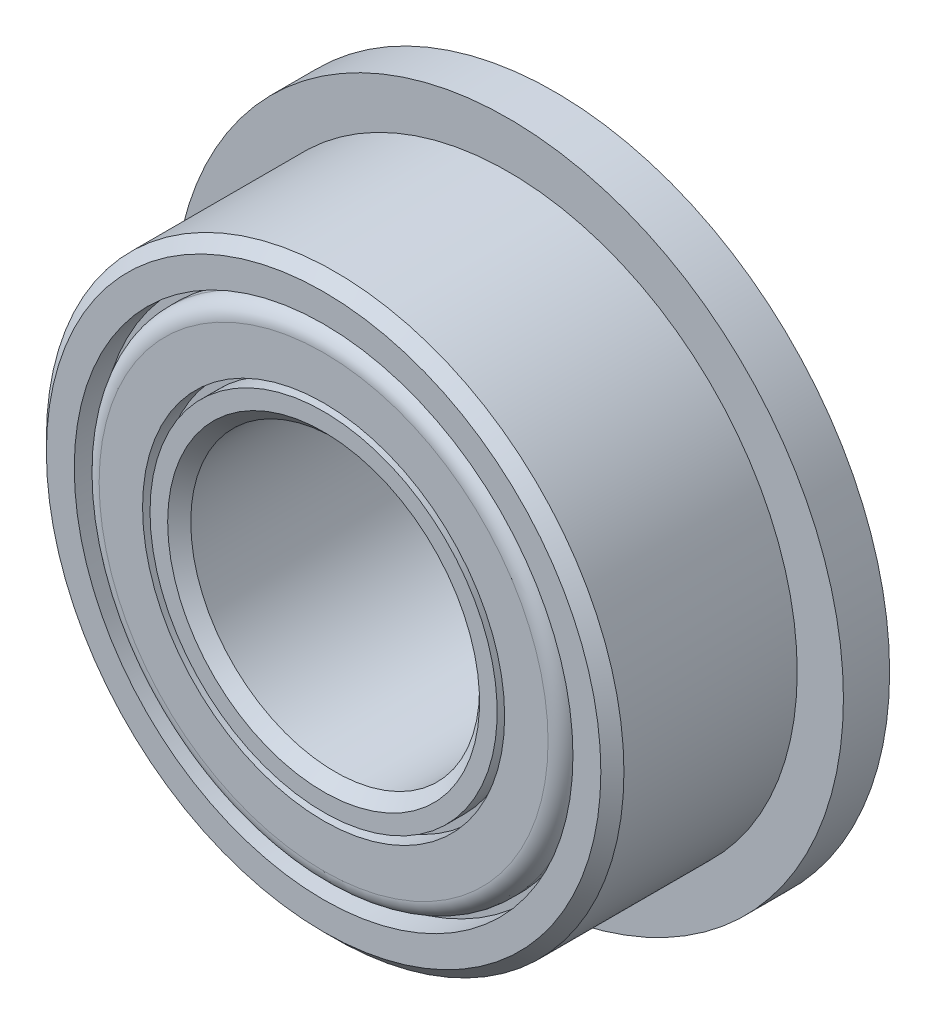
ISO-10303-21;
HEADER;
FILE_DESCRIPTION(('STEP AP214'),'2;1');
FILE_NAME('part.step','',(''),(''),'','','');
FILE_SCHEMA(('AUTOMOTIVE_DESIGN { 1 0 10303 214 1 1 1 1 }'));
ENDSEC;
DATA;
#1=APPLICATION_CONTEXT('core data for automotive mechanical design processes');
#2=APPLICATION_PROTOCOL_DEFINITION('international standard','automotive_design',2000,#1);
#3=PRODUCT_CONTEXT('',#1,'mechanical');
#4=PRODUCT('Part','Part','',(#3));
#5=PRODUCT_RELATED_PRODUCT_CATEGORY('part','',(#4));
#6=PRODUCT_DEFINITION_FORMATION('','',#4);
#7=PRODUCT_DEFINITION_CONTEXT('part definition',#1,'design');
#8=PRODUCT_DEFINITION('design','',#6,#7);
#9=PRODUCT_DEFINITION_SHAPE('','',#8);
#10=(LENGTH_UNIT() NAMED_UNIT(*) SI_UNIT(.MILLI.,.METRE.));
#11=(NAMED_UNIT(*) PLANE_ANGLE_UNIT() SI_UNIT($,.RADIAN.));
#12=(NAMED_UNIT(*) SI_UNIT($,.STERADIAN.) SOLID_ANGLE_UNIT());
#13=UNCERTAINTY_MEASURE_WITH_UNIT(LENGTH_MEASURE(1.E-05),#10,'distance_accuracy_value','');
#14=(GEOMETRIC_REPRESENTATION_CONTEXT(3) GLOBAL_UNCERTAINTY_ASSIGNED_CONTEXT((#13)) GLOBAL_UNIT_ASSIGNED_CONTEXT((#10,
#11,#12)) REPRESENTATION_CONTEXT('',''));
#15=CARTESIAN_POINT('',(0.,0.,0.));
#16=DIRECTION('',(0.,0.,1.));
#17=DIRECTION('',(1.,0.,0.));
#18=AXIS2_PLACEMENT_3D('',#15,#16,#17);
#19=CARTESIAN_POINT('',(0.,2.5,-2.));
#20=DIRECTION('',(0.,0.,1.));
#21=DIRECTION('',(1.,0.,0.));
#22=AXIS2_PLACEMENT_3D('',#19,#20,#21);
#23=PLANE('',#22);
#24=CARTESIAN_POINT('',(0.,0.,-2.));
#25=DIRECTION('',(0.,0.,-1.));
#26=DIRECTION('',(-1.,0.,0.));
#27=AXIS2_PLACEMENT_3D('',#24,#25,#26);
#28=CIRCLE('',#27,3.00552835449253);
#29=CARTESIAN_POINT('',(-3.00552835449253,0.,-2.));
#30=VERTEX_POINT('',#29);
#31=EDGE_CURVE('E103',#30,#30,#28,.T.);
#32=ORIENTED_EDGE('',*,*,#31,.T.);
#33=EDGE_LOOP('',(#32));
#34=FACE_BOUND('',#33,.T.);
#35=CARTESIAN_POINT('',(0.,0.,-2.));
#36=DIRECTION('',(0.,0.,1.));
#37=DIRECTION('',(1.,0.,0.));
#38=AXIS2_PLACEMENT_3D('',#35,#36,#37);
#39=CIRCLE('',#38,2.7);
#40=CARTESIAN_POINT('',(2.7,0.,-2.));
#41=VERTEX_POINT('',#40);
#42=EDGE_CURVE('E70',#41,#41,#39,.T.);
#43=ORIENTED_EDGE('',*,*,#42,.T.);
#44=EDGE_LOOP('',(#43));
#45=FACE_BOUND('',#44,.T.);
#46=ADVANCED_FACE('F35',(#34,#45),#23,.F.);
#47=CARTESIAN_POINT('',(0.,2.5,2.));
#48=DIRECTION('',(0.,0.,-1.));
#49=DIRECTION('',(-1.,0.,0.));
#50=AXIS2_PLACEMENT_3D('',#47,#48,#49);
#51=PLANE('',#50);
#52=CARTESIAN_POINT('',(0.,0.,2.));
#53=DIRECTION('',(0.,0.,-1.));
#54=DIRECTION('',(-1.,0.,0.));
#55=AXIS2_PLACEMENT_3D('',#52,#53,#54);
#56=CIRCLE('',#55,3.00552835449253);
#57=CARTESIAN_POINT('',(-3.00552835449253,0.,2.));
#58=VERTEX_POINT('',#57);
#59=EDGE_CURVE('E82',#58,#58,#56,.T.);
#60=ORIENTED_EDGE('',*,*,#59,.F.);
#61=EDGE_LOOP('',(#60));
#62=FACE_BOUND('',#61,.T.);
#63=CARTESIAN_POINT('',(0.,0.,2.));
#64=DIRECTION('',(0.,0.,-1.));
#65=DIRECTION('',(-1.,0.,0.));
#66=AXIS2_PLACEMENT_3D('',#63,#64,#65);
#67=CIRCLE('',#66,2.7);
#68=CARTESIAN_POINT('',(-2.7,0.,2.));
#69=VERTEX_POINT('',#68);
#70=EDGE_CURVE('E58',#69,#69,#67,.T.);
#71=ORIENTED_EDGE('',*,*,#70,.T.);
#72=EDGE_LOOP('',(#71));
#73=FACE_BOUND('',#72,.T.);
#74=ADVANCED_FACE('F147',(#62,#73),#51,.F.);
#75=CARTESIAN_POINT('',(0.,0.,2.));
#76=DIRECTION('',(0.,0.,-1.));
#77=DIRECTION('',(-1.,0.,0.));
#78=AXIS2_PLACEMENT_3D('',#75,#76,#77);
#79=CIRCLE('',#78,4.8);
#80=CARTESIAN_POINT('',(-4.8,0.,2.));
#81=VERTEX_POINT('',#80);
#82=EDGE_CURVE('E61',#81,#81,#79,.F.);
#83=ORIENTED_EDGE('',*,*,#82,.T.);
#84=EDGE_LOOP('',(#83));
#85=FACE_BOUND('',#84,.T.);
#86=CARTESIAN_POINT('',(0.,0.,2.));
#87=DIRECTION('',(0.,0.,-1.));
#88=DIRECTION('',(-1.,0.,0.));
#89=AXIS2_PLACEMENT_3D('',#86,#87,#88);
#90=CIRCLE('',#89,4.31708939227349);
#91=CARTESIAN_POINT('',(-4.31708939227349,0.,2.));
#92=VERTEX_POINT('',#91);
#93=EDGE_CURVE('E100',#92,#92,#90,.T.);
#94=ORIENTED_EDGE('',*,*,#93,.T.);
#95=EDGE_LOOP('',(#94));
#96=FACE_BOUND('',#95,.T.);
#97=ADVANCED_FACE('F142',(#85,#96),#51,.F.);
#98=CARTESIAN_POINT('',(0.,0.,0.));
#99=DIRECTION('',(0.,0.,1.));
#100=DIRECTION('',(1.,0.,0.));
#101=AXIS2_PLACEMENT_3D('',#98,#99,#100);
#102=CYLINDRICAL_SURFACE('',#101,2.5);
#103=CARTESIAN_POINT('',(0.,0.,-1.8));
#104=DIRECTION('',(0.,0.,1.));
#105=DIRECTION('',(1.,0.,0.));
#106=AXIS2_PLACEMENT_3D('',#103,#104,#105);
#107=CIRCLE('',#106,2.5);
#108=CARTESIAN_POINT('',(2.5,0.,-1.8));
#109=VERTEX_POINT('',#108);
#110=EDGE_CURVE('E64',#109,#109,#107,.F.);
#111=ORIENTED_EDGE('',*,*,#110,.T.);
#112=EDGE_LOOP('',(#111));
#113=FACE_BOUND('',#112,.T.);
#114=CARTESIAN_POINT('',(0.,0.,1.8));
#115=DIRECTION('',(0.,0.,-1.));
#116=DIRECTION('',(-1.,0.,0.));
#117=AXIS2_PLACEMENT_3D('',#114,#115,#116);
#118=CIRCLE('',#117,2.5);
#119=CARTESIAN_POINT('',(-2.5,0.,1.8));
#120=VERTEX_POINT('',#119);
#121=EDGE_CURVE('E67',#120,#120,#118,.F.);
#122=ORIENTED_EDGE('',*,*,#121,.T.);
#123=EDGE_LOOP('',(#122));
#124=FACE_BOUND('',#123,.T.);
#125=ADVANCED_FACE('F131',(#113,#124),#102,.F.);
#126=CARTESIAN_POINT('',(0.,0.,-2.));
#127=DIRECTION('',(0.,0.,1.));
#128=DIRECTION('',(1.,0.,0.));
#129=AXIS2_PLACEMENT_3D('',#126,#127,#128);
#130=CIRCLE('',#129,5.8);
#131=CARTESIAN_POINT('',(5.8,0.,-2.));
#132=VERTEX_POINT('',#131);
#133=EDGE_CURVE('E73',#132,#132,#130,.T.);
#134=ORIENTED_EDGE('',*,*,#133,.F.);
#135=EDGE_LOOP('',(#134));
#136=FACE_BOUND('',#135,.T.);
#137=CARTESIAN_POINT('',(0.,0.,-2.));
#138=DIRECTION('',(0.,0.,-1.));
#139=DIRECTION('',(-1.,0.,0.));
#140=AXIS2_PLACEMENT_3D('',#137,#138,#139);
#141=CIRCLE('',#140,4.31708939227349);
#142=CARTESIAN_POINT('',(-4.31708939227349,0.,-2.));
#143=VERTEX_POINT('',#142);
#144=EDGE_CURVE('E121',#143,#143,#141,.T.);
#145=ORIENTED_EDGE('',*,*,#144,.F.);
#146=EDGE_LOOP('',(#145));
#147=FACE_BOUND('',#146,.T.);
#148=ADVANCED_FACE('F128',(#136,#147),#23,.F.);
#149=CARTESIAN_POINT('',(0.,0.,0.));
#150=DIRECTION('',(0.,0.,1.));
#151=DIRECTION('',(1.,0.,0.));
#152=AXIS2_PLACEMENT_3D('',#149,#150,#151);
#153=CYLINDRICAL_SURFACE('',#152,5.8);
#154=CARTESIAN_POINT('',(0.,0.,-1.2));
#155=DIRECTION('',(0.,0.,1.));
#156=DIRECTION('',(1.,0.,0.));
#157=AXIS2_PLACEMENT_3D('',#154,#155,#156);
#158=CIRCLE('',#157,5.8);
#159=CARTESIAN_POINT('',(5.8,0.,-1.2));
#160=VERTEX_POINT('',#159);
#161=EDGE_CURVE('E76',#160,#160,#158,.T.);
#162=ORIENTED_EDGE('',*,*,#161,.F.);
#163=EDGE_LOOP('',(#162));
#164=FACE_BOUND('',#163,.T.);
#165=ORIENTED_EDGE('',*,*,#133,.T.);
#166=EDGE_LOOP('',(#165));
#167=FACE_BOUND('',#166,.T.);
#168=ADVANCED_FACE('F130',(#164,#167),#153,.T.);
#169=CARTESIAN_POINT('',(0.,5.,-1.2));
#170=DIRECTION('',(0.,0.,-1.));
#171=DIRECTION('',(-1.,0.,0.));
#172=AXIS2_PLACEMENT_3D('',#169,#170,#171);
#173=PLANE('',#172);
#174=CARTESIAN_POINT('',(0.,0.,-1.2));
#175=DIRECTION('',(0.,0.,1.));
#176=DIRECTION('',(1.,0.,0.));
#177=AXIS2_PLACEMENT_3D('',#174,#175,#176);
#178=CIRCLE('',#177,5.);
#179=CARTESIAN_POINT('',(5.,0.,-1.2));
#180=VERTEX_POINT('',#179);
#181=EDGE_CURVE('E79',#180,#180,#178,.T.);
#182=ORIENTED_EDGE('',*,*,#181,.F.);
#183=EDGE_LOOP('',(#182));
#184=FACE_BOUND('',#183,.T.);
#185=ORIENTED_EDGE('',*,*,#161,.T.);
#186=EDGE_LOOP('',(#185));
#187=FACE_BOUND('',#186,.T.);
#188=ADVANCED_FACE('F139',(#184,#187),#173,.F.);
#189=CARTESIAN_POINT('',(0.,0.,0.));
#190=DIRECTION('',(0.,0.,1.));
#191=DIRECTION('',(1.,0.,0.));
#192=AXIS2_PLACEMENT_3D('',#189,#190,#191);
#193=CYLINDRICAL_SURFACE('',#192,5.);
#194=CARTESIAN_POINT('',(0.,0.,1.8));
#195=DIRECTION('',(0.,0.,-1.));
#196=DIRECTION('',(-1.,0.,0.));
#197=AXIS2_PLACEMENT_3D('',#194,#195,#196);
#198=CIRCLE('',#197,5.);
#199=CARTESIAN_POINT('',(-5.,0.,1.8));
#200=VERTEX_POINT('',#199);
#201=EDGE_CURVE('E55',#200,#200,#198,.T.);
#202=ORIENTED_EDGE('',*,*,#201,.T.);
#203=EDGE_LOOP('',(#202));
#204=FACE_BOUND('',#203,.T.);
#205=ORIENTED_EDGE('',*,*,#181,.T.);
#206=EDGE_LOOP('',(#205));
#207=FACE_BOUND('',#206,.T.);
#208=ADVANCED_FACE('F184',(#204,#207),#193,.T.);
#209=CARTESIAN_POINT('',(0.,0.,-2.));
#210=DIRECTION('',(0.,0.,-1.));
#211=DIRECTION('',(-1.,0.,0.));
#212=AXIS2_PLACEMENT_3D('',#209,#210,#211);
#213=CONICAL_SURFACE('',#212,2.7,0.785398163397444);
#214=ORIENTED_EDGE('',*,*,#110,.F.);
#215=EDGE_LOOP('',(#214));
#216=FACE_BOUND('',#215,.T.);
#217=ORIENTED_EDGE('',*,*,#42,.F.);
#218=EDGE_LOOP('',(#217));
#219=FACE_BOUND('',#218,.T.);
#220=ADVANCED_FACE('F181',(#216,#219),#213,.F.);
#221=CARTESIAN_POINT('',(0.,0.,1.8));
#222=DIRECTION('',(0.,0.,1.));
#223=DIRECTION('',(1.,0.,0.));
#224=AXIS2_PLACEMENT_3D('',#221,#222,#223);
#225=CONICAL_SURFACE('',#224,2.5,0.785398163397458);
#226=ORIENTED_EDGE('',*,*,#70,.F.);
#227=EDGE_LOOP('',(#226));
#228=FACE_BOUND('',#227,.T.);
#229=ORIENTED_EDGE('',*,*,#121,.F.);
#230=EDGE_LOOP('',(#229));
#231=FACE_BOUND('',#230,.T.);
#232=ADVANCED_FACE('F183',(#228,#231),#225,.F.);
#233=CARTESIAN_POINT('',(0.,0.,2.));
#234=DIRECTION('',(0.,0.,-1.));
#235=DIRECTION('',(-1.,0.,0.));
#236=AXIS2_PLACEMENT_3D('',#233,#234,#235);
#237=CONICAL_SURFACE('',#236,4.8,0.785398163397442);
#238=ORIENTED_EDGE('',*,*,#201,.F.);
#239=EDGE_LOOP('',(#238));
#240=FACE_BOUND('',#239,.T.);
#241=ORIENTED_EDGE('',*,*,#82,.F.);
#242=EDGE_LOOP('',(#241));
#243=FACE_BOUND('',#242,.T.);
#244=ADVANCED_FACE('F191',(#240,#243),#237,.T.);
#245=CARTESIAN_POINT('',(0.,0.,-2.));
#246=DIRECTION('',(0.,0.,-1.));
#247=DIRECTION('',(-1.,0.,0.));
#248=AXIS2_PLACEMENT_3D('',#245,#246,#247);
#249=CYLINDRICAL_SURFACE('',#248,4.18607771447362);
#250=CARTESIAN_POINT('',(0.,0.,1.7));
#251=DIRECTION('',(0.,0.,-1.));
#252=DIRECTION('',(-1.,0.,0.));
#253=AXIS2_PLACEMENT_3D('',#250,#251,#252);
#254=CIRCLE('',#253,4.18607771447362);
#255=CARTESIAN_POINT('',(-4.18607771447362,0.,1.7));
#256=VERTEX_POINT('',#255);
#257=EDGE_CURVE('E42',#256,#256,#254,.T.);
#258=ORIENTED_EDGE('',*,*,#257,.T.);
#259=EDGE_LOOP('',(#258));
#260=FACE_BOUND('',#259,.T.);
#261=CARTESIAN_POINT('',(0.,0.,1.5567562858223));
#262=DIRECTION('',(0.,0.,-1.));
#263=DIRECTION('',(-1.,0.,0.));
#264=AXIS2_PLACEMENT_3D('',#261,#262,#263);
#265=CIRCLE('',#264,4.18607771447362);
#266=CARTESIAN_POINT('',(-4.18607771447362,0.,1.5567562858223));
#267=VERTEX_POINT('',#266);
#268=EDGE_CURVE('E94',#267,#267,#265,.T.);
#269=ORIENTED_EDGE('',*,*,#268,.F.);
#270=EDGE_LOOP('',(#269));
#271=FACE_BOUND('',#270,.T.);
#272=ADVANCED_FACE('F209',(#260,#271),#249,.T.);
#273=CARTESIAN_POINT('',(0.,4.31708939227349,1.5567562858223));
#274=DIRECTION('',(0.,0.,-1.));
#275=DIRECTION('',(-1.,0.,0.));
#276=AXIS2_PLACEMENT_3D('',#273,#274,#275);
#277=PLANE('',#276);
#278=CARTESIAN_POINT('',(0.,0.,1.5567562858223));
#279=DIRECTION('',(0.,0.,-1.));
#280=DIRECTION('',(-1.,0.,0.));
#281=AXIS2_PLACEMENT_3D('',#278,#279,#280);
#282=CIRCLE('',#281,4.31708939227349);
#283=CARTESIAN_POINT('',(-4.31708939227349,0.,1.5567562858223));
#284=VERTEX_POINT('',#283);
#285=EDGE_CURVE('E97',#284,#284,#282,.T.);
#286=ORIENTED_EDGE('',*,*,#285,.F.);
#287=EDGE_LOOP('',(#286));
#288=FACE_BOUND('',#287,.T.);
#289=ORIENTED_EDGE('',*,*,#268,.T.);
#290=EDGE_LOOP('',(#289));
#291=FACE_BOUND('',#290,.T.);
#292=ADVANCED_FACE('F237',(#288,#291),#277,.F.);
#293=CARTESIAN_POINT('',(0.,0.,-2.));
#294=DIRECTION('',(0.,0.,-1.));
#295=DIRECTION('',(-1.,0.,0.));
#296=AXIS2_PLACEMENT_3D('',#293,#294,#295);
#297=CYLINDRICAL_SURFACE('',#296,4.31708939227349);
#298=ORIENTED_EDGE('',*,*,#93,.F.);
#299=EDGE_LOOP('',(#298));
#300=FACE_BOUND('',#299,.T.);
#301=ORIENTED_EDGE('',*,*,#285,.T.);
#302=EDGE_LOOP('',(#301));
#303=FACE_BOUND('',#302,.T.);
#304=ADVANCED_FACE('F233',(#300,#303),#297,.F.);
#305=CARTESIAN_POINT('',(0.,0.,2.));
#306=DIRECTION('',(0.,0.,-1.));
#307=DIRECTION('',(-1.,0.,0.));
#308=AXIS2_PLACEMENT_3D('',#305,#306,#307);
#309=CIRCLE('',#308,3.88607771447362);
#310=CARTESIAN_POINT('',(-3.88607771447362,0.,2.));
#311=VERTEX_POINT('',#310);
#312=EDGE_CURVE('E10',#311,#311,#309,.F.);
#313=ORIENTED_EDGE('',*,*,#312,.T.);
#314=EDGE_LOOP('',(#313));
#315=FACE_BOUND('',#314,.T.);
#316=CARTESIAN_POINT('',(0.,0.,2.));
#317=DIRECTION('',(0.,0.,-1.));
#318=DIRECTION('',(-1.,0.,0.));
#319=AXIS2_PLACEMENT_3D('',#316,#317,#318);
#320=CIRCLE('',#319,3.13447841749337);
#321=CARTESIAN_POINT('',(-3.13447841749337,0.,2.));
#322=VERTEX_POINT('',#321);
#323=EDGE_CURVE('E91',#322,#322,#320,.T.);
#324=ORIENTED_EDGE('',*,*,#323,.T.);
#325=EDGE_LOOP('',(#324));
#326=FACE_BOUND('',#325,.T.);
#327=ADVANCED_FACE('F236',(#315,#326),#51,.F.);
#328=CARTESIAN_POINT('',(0.,0.,-2.));
#329=DIRECTION('',(0.,0.,-1.));
#330=DIRECTION('',(-1.,0.,0.));
#331=AXIS2_PLACEMENT_3D('',#328,#329,#330);
#332=CYLINDRICAL_SURFACE('',#331,3.00552835449253);
#333=CARTESIAN_POINT('',(0.,0.,1.66802482356852));
#334=DIRECTION('',(0.,0.,-1.));
#335=DIRECTION('',(-1.,0.,0.));
#336=AXIS2_PLACEMENT_3D('',#333,#334,#335);
#337=CIRCLE('',#336,3.00552835449253);
#338=CARTESIAN_POINT('',(-3.00552835449253,0.,1.66802482356852));
#339=VERTEX_POINT('',#338);
#340=EDGE_CURVE('E85',#339,#339,#337,.T.);
#341=ORIENTED_EDGE('',*,*,#340,.F.);
#342=EDGE_LOOP('',(#341));
#343=FACE_BOUND('',#342,.T.);
#344=ORIENTED_EDGE('',*,*,#59,.T.);
#345=EDGE_LOOP('',(#344));
#346=FACE_BOUND('',#345,.T.);
#347=ADVANCED_FACE('F250',(#343,#346),#332,.T.);
#348=CARTESIAN_POINT('',(0.,3.13447841749337,1.66802482356852));
#349=DIRECTION('',(0.,0.,-1.));
#350=DIRECTION('',(-1.,0.,0.));
#351=AXIS2_PLACEMENT_3D('',#348,#349,#350);
#352=PLANE('',#351);
#353=CARTESIAN_POINT('',(0.,0.,1.66802482356852));
#354=DIRECTION('',(0.,0.,-1.));
#355=DIRECTION('',(-1.,0.,0.));
#356=AXIS2_PLACEMENT_3D('',#353,#354,#355);
#357=CIRCLE('',#356,3.13447841749337);
#358=CARTESIAN_POINT('',(-3.13447841749337,0.,1.66802482356852));
#359=VERTEX_POINT('',#358);
#360=EDGE_CURVE('E88',#359,#359,#357,.T.);
#361=ORIENTED_EDGE('',*,*,#360,.F.);
#362=EDGE_LOOP('',(#361));
#363=FACE_BOUND('',#362,.T.);
#364=ORIENTED_EDGE('',*,*,#340,.T.);
#365=EDGE_LOOP('',(#364));
#366=FACE_BOUND('',#365,.T.);
#367=ADVANCED_FACE('F246',(#363,#366),#352,.F.);
#368=CARTESIAN_POINT('',(0.,0.,-2.));
#369=DIRECTION('',(0.,0.,-1.));
#370=DIRECTION('',(-1.,0.,0.));
#371=AXIS2_PLACEMENT_3D('',#368,#369,#370);
#372=CYLINDRICAL_SURFACE('',#371,3.13447841749337);
#373=ORIENTED_EDGE('',*,*,#323,.F.);
#374=EDGE_LOOP('',(#373));
#375=FACE_BOUND('',#374,.T.);
#376=ORIENTED_EDGE('',*,*,#360,.T.);
#377=EDGE_LOOP('',(#376));
#378=FACE_BOUND('',#377,.T.);
#379=ADVANCED_FACE('F223',(#375,#378),#372,.F.);
#380=CARTESIAN_POINT('',(0.,0.,2.));
#381=DIRECTION('',(0.,0.,1.));
#382=DIRECTION('',(-1.,0.,0.));
#383=AXIS2_PLACEMENT_3D('',#380,#381,#382);
#384=CYLINDRICAL_SURFACE('',#383,4.18607771447362);
#385=CARTESIAN_POINT('',(0.,0.,-1.7));
#386=DIRECTION('',(0.,0.,1.));
#387=DIRECTION('',(1.,0.,0.));
#388=AXIS2_PLACEMENT_3D('',#385,#386,#387);
#389=CIRCLE('',#388,4.18607771447362);
#390=CARTESIAN_POINT('',(4.18607771447362,0.,-1.7));
#391=VERTEX_POINT('',#390);
#392=EDGE_CURVE('E46',#391,#391,#389,.T.);
#393=ORIENTED_EDGE('',*,*,#392,.T.);
#394=EDGE_LOOP('',(#393));
#395=FACE_BOUND('',#394,.T.);
#396=CARTESIAN_POINT('',(0.,0.,-1.5567562858223));
#397=DIRECTION('',(0.,0.,-1.));
#398=DIRECTION('',(-1.,0.,0.));
#399=AXIS2_PLACEMENT_3D('',#396,#397,#398);
#400=CIRCLE('',#399,4.18607771447362);
#401=CARTESIAN_POINT('',(-4.18607771447362,0.,-1.5567562858223));
#402=VERTEX_POINT('',#401);
#403=EDGE_CURVE('E115',#402,#402,#400,.T.);
#404=ORIENTED_EDGE('',*,*,#403,.T.);
#405=EDGE_LOOP('',(#404));
#406=FACE_BOUND('',#405,.T.);
#407=ADVANCED_FACE('F220',(#395,#406),#384,.T.);
#408=CARTESIAN_POINT('',(0.,4.31708939227349,-1.5567562858223));
#409=DIRECTION('',(0.,0.,1.));
#410=DIRECTION('',(-1.,0.,0.));
#411=AXIS2_PLACEMENT_3D('',#408,#409,#410);
#412=PLANE('',#411);
#413=CARTESIAN_POINT('',(0.,0.,-1.5567562858223));
#414=DIRECTION('',(0.,0.,-1.));
#415=DIRECTION('',(-1.,0.,0.));
#416=AXIS2_PLACEMENT_3D('',#413,#414,#415);
#417=CIRCLE('',#416,4.31708939227349);
#418=CARTESIAN_POINT('',(-4.31708939227349,0.,-1.5567562858223));
#419=VERTEX_POINT('',#418);
#420=EDGE_CURVE('E118',#419,#419,#417,.T.);
#421=ORIENTED_EDGE('',*,*,#420,.T.);
#422=EDGE_LOOP('',(#421));
#423=FACE_BOUND('',#422,.T.);
#424=ORIENTED_EDGE('',*,*,#403,.F.);
#425=EDGE_LOOP('',(#424));
#426=FACE_BOUND('',#425,.T.);
#427=ADVANCED_FACE('F159',(#423,#426),#412,.F.);
#428=CARTESIAN_POINT('',(0.,0.,2.));
#429=DIRECTION('',(0.,0.,1.));
#430=DIRECTION('',(-1.,0.,0.));
#431=AXIS2_PLACEMENT_3D('',#428,#429,#430);
#432=CYLINDRICAL_SURFACE('',#431,4.31708939227349);
#433=ORIENTED_EDGE('',*,*,#144,.T.);
#434=EDGE_LOOP('',(#433));
#435=FACE_BOUND('',#434,.T.);
#436=ORIENTED_EDGE('',*,*,#420,.F.);
#437=EDGE_LOOP('',(#436));
#438=FACE_BOUND('',#437,.T.);
#439=ADVANCED_FACE('F125',(#435,#438),#432,.F.);
#440=CARTESIAN_POINT('',(0.,0.,-2.));
#441=DIRECTION('',(0.,0.,1.));
#442=DIRECTION('',(1.,0.,0.));
#443=AXIS2_PLACEMENT_3D('',#440,#441,#442);
#444=CIRCLE('',#443,3.88607771447362);
#445=CARTESIAN_POINT('',(3.88607771447362,0.,-2.));
#446=VERTEX_POINT('',#445);
#447=EDGE_CURVE('E50',#446,#446,#444,.F.);
#448=ORIENTED_EDGE('',*,*,#447,.T.);
#449=EDGE_LOOP('',(#448));
#450=FACE_BOUND('',#449,.T.);
#451=CARTESIAN_POINT('',(0.,0.,-2.));
#452=DIRECTION('',(0.,0.,-1.));
#453=DIRECTION('',(-1.,0.,0.));
#454=AXIS2_PLACEMENT_3D('',#451,#452,#453);
#455=CIRCLE('',#454,3.13447841749337);
#456=CARTESIAN_POINT('',(-3.13447841749337,0.,-2.));
#457=VERTEX_POINT('',#456);
#458=EDGE_CURVE('E112',#457,#457,#455,.T.);
#459=ORIENTED_EDGE('',*,*,#458,.F.);
#460=EDGE_LOOP('',(#459));
#461=FACE_BOUND('',#460,.T.);
#462=ADVANCED_FACE('F134',(#450,#461),#23,.F.);
#463=CARTESIAN_POINT('',(0.,0.,2.));
#464=DIRECTION('',(0.,0.,1.));
#465=DIRECTION('',(-1.,0.,0.));
#466=AXIS2_PLACEMENT_3D('',#463,#464,#465);
#467=CYLINDRICAL_SURFACE('',#466,3.00552835449253);
#468=CARTESIAN_POINT('',(0.,0.,-1.66802482356852));
#469=DIRECTION('',(0.,0.,-1.));
#470=DIRECTION('',(-1.,0.,0.));
#471=AXIS2_PLACEMENT_3D('',#468,#469,#470);
#472=CIRCLE('',#471,3.00552835449253);
#473=CARTESIAN_POINT('',(-3.00552835449253,0.,-1.66802482356852));
#474=VERTEX_POINT('',#473);
#475=EDGE_CURVE('E106',#474,#474,#472,.T.);
#476=ORIENTED_EDGE('',*,*,#475,.T.);
#477=EDGE_LOOP('',(#476));
#478=FACE_BOUND('',#477,.T.);
#479=ORIENTED_EDGE('',*,*,#31,.F.);
#480=EDGE_LOOP('',(#479));
#481=FACE_BOUND('',#480,.T.);
#482=ADVANCED_FACE('F150',(#478,#481),#467,.T.);
#483=CARTESIAN_POINT('',(0.,3.13447841749337,-1.66802482356852));
#484=DIRECTION('',(0.,0.,1.));
#485=DIRECTION('',(-1.,0.,0.));
#486=AXIS2_PLACEMENT_3D('',#483,#484,#485);
#487=PLANE('',#486);
#488=CARTESIAN_POINT('',(0.,0.,-1.66802482356852));
#489=DIRECTION('',(0.,0.,-1.));
#490=DIRECTION('',(-1.,0.,0.));
#491=AXIS2_PLACEMENT_3D('',#488,#489,#490);
#492=CIRCLE('',#491,3.13447841749337);
#493=CARTESIAN_POINT('',(-3.13447841749337,0.,-1.66802482356852));
#494=VERTEX_POINT('',#493);
#495=EDGE_CURVE('E109',#494,#494,#492,.T.);
#496=ORIENTED_EDGE('',*,*,#495,.T.);
#497=EDGE_LOOP('',(#496));
#498=FACE_BOUND('',#497,.T.);
#499=ORIENTED_EDGE('',*,*,#475,.F.);
#500=EDGE_LOOP('',(#499));
#501=FACE_BOUND('',#500,.T.);
#502=ADVANCED_FACE('F156',(#498,#501),#487,.F.);
#503=CARTESIAN_POINT('',(0.,0.,2.));
#504=DIRECTION('',(0.,0.,1.));
#505=DIRECTION('',(-1.,0.,0.));
#506=AXIS2_PLACEMENT_3D('',#503,#504,#505);
#507=CYLINDRICAL_SURFACE('',#506,3.13447841749337);
#508=ORIENTED_EDGE('',*,*,#458,.T.);
#509=EDGE_LOOP('',(#508));
#510=FACE_BOUND('',#509,.T.);
#511=ORIENTED_EDGE('',*,*,#495,.F.);
#512=EDGE_LOOP('',(#511));
#513=FACE_BOUND('',#512,.T.);
#514=ADVANCED_FACE('F165',(#510,#513),#507,.F.);
#515=CARTESIAN_POINT('',(0.,0.,-1.7));
#516=DIRECTION('',(0.,0.,1.));
#517=DIRECTION('',(1.,0.,0.));
#518=AXIS2_PLACEMENT_3D('',#515,#516,#517);
#519=TOROIDAL_SURFACE('',#518,3.88607771447362,0.3);
#520=ORIENTED_EDGE('',*,*,#392,.F.);
#521=EDGE_LOOP('',(#520));
#522=FACE_BOUND('',#521,.T.);
#523=ORIENTED_EDGE('',*,*,#447,.F.);
#524=EDGE_LOOP('',(#523));
#525=FACE_BOUND('',#524,.T.);
#526=ADVANCED_FACE('F168',(#522,#525),#519,.T.);
#527=CARTESIAN_POINT('',(0.,0.,1.7));
#528=DIRECTION('',(0.,0.,-1.));
#529=DIRECTION('',(-1.,0.,0.));
#530=AXIS2_PLACEMENT_3D('',#527,#528,#529);
#531=TOROIDAL_SURFACE('',#530,3.88607771447362,0.3);
#532=ORIENTED_EDGE('',*,*,#312,.F.);
#533=EDGE_LOOP('',(#532));
#534=FACE_BOUND('',#533,.T.);
#535=ORIENTED_EDGE('',*,*,#257,.F.);
#536=EDGE_LOOP('',(#535));
#537=FACE_BOUND('',#536,.T.);
#538=ADVANCED_FACE('F37',(#534,#537),#531,.T.);
#539=CLOSED_SHELL('',(#46,#74,#97,#125,#148,#168,#188,#208,#220,#232,#244,#272,#292,#304,#327,
#347,#367,#379,#407,#427,#439,#462,#482,#502,#514,#526,#538));
#540=MANIFOLD_SOLID_BREP('B2',#539);
#541=ADVANCED_BREP_SHAPE_REPRESENTATION('',(#18,#540),#14);
#542=SHAPE_DEFINITION_REPRESENTATION(#9,#541);
ENDSEC;
END-ISO-10303-21;
